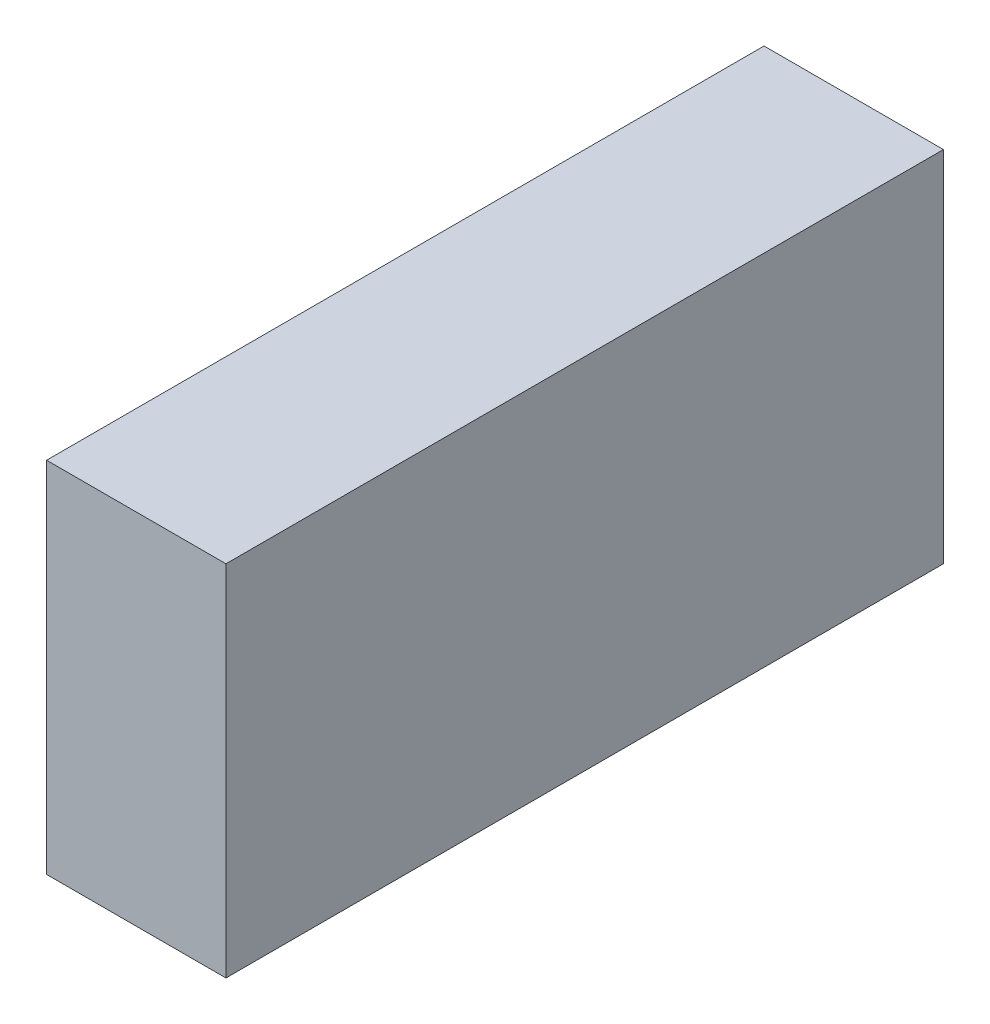
ISO-10303-21;
HEADER;
FILE_DESCRIPTION(('STEP AP214'),'2;1');
FILE_NAME('part.step','',(''),(''),'','','');
FILE_SCHEMA(('AUTOMOTIVE_DESIGN { 1 0 10303 214 1 1 1 1 }'));
ENDSEC;
DATA;
#1=APPLICATION_CONTEXT('core data for automotive mechanical design processes');
#2=APPLICATION_PROTOCOL_DEFINITION('international standard','automotive_design',2000,#1);
#3=PRODUCT_CONTEXT('',#1,'mechanical');
#4=PRODUCT('Part','Part','',(#3));
#5=PRODUCT_RELATED_PRODUCT_CATEGORY('part','',(#4));
#6=PRODUCT_DEFINITION_FORMATION('','',#4);
#7=PRODUCT_DEFINITION_CONTEXT('part definition',#1,'design');
#8=PRODUCT_DEFINITION('design','',#6,#7);
#9=PRODUCT_DEFINITION_SHAPE('','',#8);
#10=(LENGTH_UNIT() NAMED_UNIT(*) SI_UNIT(.MILLI.,.METRE.));
#11=(NAMED_UNIT(*) PLANE_ANGLE_UNIT() SI_UNIT($,.RADIAN.));
#12=(NAMED_UNIT(*) SI_UNIT($,.STERADIAN.) SOLID_ANGLE_UNIT());
#13=UNCERTAINTY_MEASURE_WITH_UNIT(LENGTH_MEASURE(1.E-05),#10,'distance_accuracy_value','');
#14=(GEOMETRIC_REPRESENTATION_CONTEXT(3) GLOBAL_UNCERTAINTY_ASSIGNED_CONTEXT((#13)) GLOBAL_UNIT_ASSIGNED_CONTEXT((#10,
#11,#12)) REPRESENTATION_CONTEXT('',''));
#15=CARTESIAN_POINT('',(0.,0.,0.));
#16=DIRECTION('',(0.,0.,1.));
#17=DIRECTION('',(1.,0.,0.));
#18=AXIS2_PLACEMENT_3D('',#15,#16,#17);
#19=CARTESIAN_POINT('',(-10.,0.,0.));
#20=DIRECTION('',(0.,0.,1.));
#21=DIRECTION('',(1.,0.,0.));
#22=AXIS2_PLACEMENT_3D('',#19,#20,#21);
#23=PLANE('',#22);
#24=DIRECTION('',(0.,-1.,0.));
#25=VECTOR('',#24,1.);
#26=CARTESIAN_POINT('',(0.,0.,0.));
#27=LINE('',#26,#25);
#28=CARTESIAN_POINT('',(0.,20.,0.));
#29=VERTEX_POINT('',#28);
#30=CARTESIAN_POINT('',(0.,0.,0.));
#31=VERTEX_POINT('',#30);
#32=EDGE_CURVE('E107',#29,#31,#27,.T.);
#33=ORIENTED_EDGE('',*,*,#32,.F.);
#34=DIRECTION('',(1.,0.,0.));
#35=VECTOR('',#34,1.);
#36=CARTESIAN_POINT('',(-10.,20.,0.));
#37=LINE('',#36,#35);
#38=CARTESIAN_POINT('',(-10.,20.,0.));
#39=VERTEX_POINT('',#38);
#40=EDGE_CURVE('E11',#39,#29,#37,.T.);
#41=ORIENTED_EDGE('',*,*,#40,.F.);
#42=DIRECTION('',(0.,-1.,0.));
#43=VECTOR('',#42,1.);
#44=CARTESIAN_POINT('',(-10.,0.,0.));
#45=LINE('',#44,#43);
#46=CARTESIAN_POINT('',(-10.,0.,0.));
#47=VERTEX_POINT('',#46);
#48=EDGE_CURVE('E102',#39,#47,#45,.T.);
#49=ORIENTED_EDGE('',*,*,#48,.T.);
#50=DIRECTION('',(1.,0.,0.));
#51=VECTOR('',#50,1.);
#52=CARTESIAN_POINT('',(-10.,0.,0.));
#53=LINE('',#52,#51);
#54=EDGE_CURVE('E46',#47,#31,#53,.T.);
#55=ORIENTED_EDGE('',*,*,#54,.T.);
#56=EDGE_LOOP('',(#33,#41,#49,#55));
#57=FACE_BOUND('',#56,.T.);
#58=ADVANCED_FACE('F43',(#57),#23,.T.);
#59=CARTESIAN_POINT('',(-10.,20.,0.));
#60=DIRECTION('',(0.,1.,0.));
#61=DIRECTION('',(0.,0.,1.));
#62=AXIS2_PLACEMENT_3D('',#59,#60,#61);
#63=PLANE('',#62);
#64=DIRECTION('',(0.,0.,1.));
#65=VECTOR('',#64,1.);
#66=CARTESIAN_POINT('',(0.,20.,0.));
#67=LINE('',#66,#65);
#68=CARTESIAN_POINT('',(0.,20.,-40.));
#69=VERTEX_POINT('',#68);
#70=EDGE_CURVE('E104',#69,#29,#67,.T.);
#71=ORIENTED_EDGE('',*,*,#70,.F.);
#72=DIRECTION('',(1.,0.,0.));
#73=VECTOR('',#72,1.);
#74=CARTESIAN_POINT('',(-10.,20.,-40.));
#75=LINE('',#74,#73);
#76=CARTESIAN_POINT('',(-10.,20.,-40.));
#77=VERTEX_POINT('',#76);
#78=EDGE_CURVE('E55',#77,#69,#75,.T.);
#79=ORIENTED_EDGE('',*,*,#78,.F.);
#80=DIRECTION('',(0.,0.,1.));
#81=VECTOR('',#80,1.);
#82=CARTESIAN_POINT('',(-10.,20.,0.));
#83=LINE('',#82,#81);
#84=EDGE_CURVE('E97',#77,#39,#83,.T.);
#85=ORIENTED_EDGE('',*,*,#84,.T.);
#86=ORIENTED_EDGE('',*,*,#40,.T.);
#87=EDGE_LOOP('',(#71,#79,#85,#86));
#88=FACE_BOUND('',#87,.T.);
#89=ADVANCED_FACE('F117',(#88),#63,.T.);
#90=CARTESIAN_POINT('',(-10.,0.,-40.));
#91=DIRECTION('',(0.,0.,-1.));
#92=DIRECTION('',(-1.,0.,0.));
#93=AXIS2_PLACEMENT_3D('',#90,#91,#92);
#94=PLANE('',#93);
#95=DIRECTION('',(0.,1.,0.));
#96=VECTOR('',#95,1.);
#97=CARTESIAN_POINT('',(0.,0.,-40.));
#98=LINE('',#97,#96);
#99=CARTESIAN_POINT('',(0.,0.,-40.));
#100=VERTEX_POINT('',#99);
#101=EDGE_CURVE('E93',#100,#69,#98,.T.);
#102=ORIENTED_EDGE('',*,*,#101,.F.);
#103=DIRECTION('',(1.,0.,0.));
#104=VECTOR('',#103,1.);
#105=CARTESIAN_POINT('',(-10.,0.,-40.));
#106=LINE('',#105,#104);
#107=CARTESIAN_POINT('',(-10.,0.,-40.));
#108=VERTEX_POINT('',#107);
#109=EDGE_CURVE('E88',#108,#100,#106,.T.);
#110=ORIENTED_EDGE('',*,*,#109,.F.);
#111=DIRECTION('',(0.,1.,0.));
#112=VECTOR('',#111,1.);
#113=CARTESIAN_POINT('',(-10.,0.,-40.));
#114=LINE('',#113,#112);
#115=EDGE_CURVE('E91',#108,#77,#114,.T.);
#116=ORIENTED_EDGE('',*,*,#115,.T.);
#117=ORIENTED_EDGE('',*,*,#78,.T.);
#118=EDGE_LOOP('',(#102,#110,#116,#117));
#119=FACE_BOUND('',#118,.T.);
#120=ADVANCED_FACE('F89',(#119),#94,.T.);
#121=CARTESIAN_POINT('',(-10.,0.,0.));
#122=DIRECTION('',(0.,-1.,0.));
#123=DIRECTION('',(0.,0.,-1.));
#124=AXIS2_PLACEMENT_3D('',#121,#122,#123);
#125=PLANE('',#124);
#126=DIRECTION('',(0.,0.,-1.));
#127=VECTOR('',#126,1.);
#128=CARTESIAN_POINT('',(0.,0.,0.));
#129=LINE('',#128,#127);
#130=EDGE_CURVE('E110',#31,#100,#129,.T.);
#131=ORIENTED_EDGE('',*,*,#130,.F.);
#132=ORIENTED_EDGE('',*,*,#54,.F.);
#133=DIRECTION('',(0.,0.,-1.));
#134=VECTOR('',#133,1.);
#135=CARTESIAN_POINT('',(-10.,0.,0.));
#136=LINE('',#135,#134);
#137=EDGE_CURVE('E100',#47,#108,#136,.T.);
#138=ORIENTED_EDGE('',*,*,#137,.T.);
#139=ORIENTED_EDGE('',*,*,#109,.T.);
#140=EDGE_LOOP('',(#131,#132,#138,#139));
#141=FACE_BOUND('',#140,.T.);
#142=ADVANCED_FACE('F99',(#141),#125,.T.);
#143=CARTESIAN_POINT('',(-10.,0.,0.));
#144=DIRECTION('',(-1.,0.,0.));
#145=DIRECTION('',(0.,0.,1.));
#146=AXIS2_PLACEMENT_3D('',#143,#144,#145);
#147=PLANE('',#146);
#148=ORIENTED_EDGE('',*,*,#48,.F.);
#149=ORIENTED_EDGE('',*,*,#84,.F.);
#150=ORIENTED_EDGE('',*,*,#115,.F.);
#151=ORIENTED_EDGE('',*,*,#137,.F.);
#152=EDGE_LOOP('',(#148,#149,#150,#151));
#153=FACE_BOUND('',#152,.T.);
#154=ADVANCED_FACE('F96',(#153),#147,.T.);
#155=CARTESIAN_POINT('',(0.,0.,0.));
#156=DIRECTION('',(-1.,0.,0.));
#157=DIRECTION('',(0.,0.,1.));
#158=AXIS2_PLACEMENT_3D('',#155,#156,#157);
#159=PLANE('',#158);
#160=ORIENTED_EDGE('',*,*,#32,.T.);
#161=ORIENTED_EDGE('',*,*,#130,.T.);
#162=ORIENTED_EDGE('',*,*,#101,.T.);
#163=ORIENTED_EDGE('',*,*,#70,.T.);
#164=EDGE_LOOP('',(#160,#161,#162,#163));
#165=FACE_BOUND('',#164,.T.);
#166=ADVANCED_FACE('F116',(#165),#159,.F.);
#167=CLOSED_SHELL('',(#58,#89,#120,#142,#154,#166));
#168=MANIFOLD_SOLID_BREP('B2',#167);
#169=ADVANCED_BREP_SHAPE_REPRESENTATION('',(#18,#168),#14);
#170=SHAPE_DEFINITION_REPRESENTATION(#9,#169);
ENDSEC;
END-ISO-10303-21;
